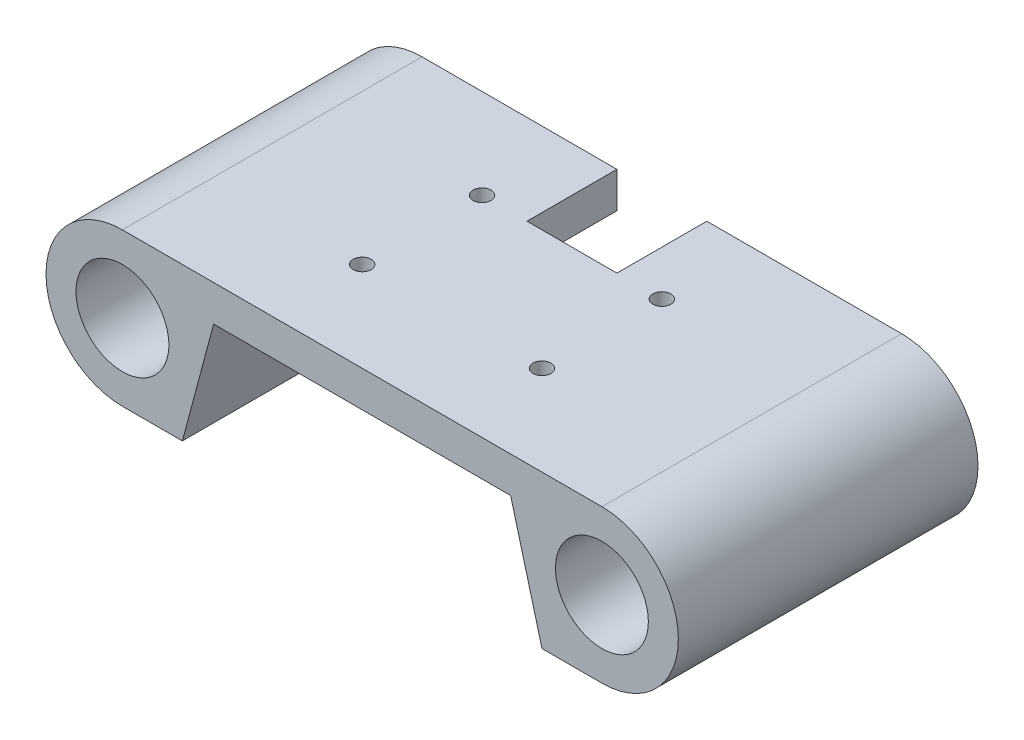
ISO-10303-21;
HEADER;
FILE_DESCRIPTION(('STEP AP214'),'2;1');
FILE_NAME('part.step','',(''),(''),'','','');
FILE_SCHEMA(('AUTOMOTIVE_DESIGN { 1 0 10303 214 1 1 1 1 }'));
ENDSEC;
DATA;
#1=APPLICATION_CONTEXT('core data for automotive mechanical design processes');
#2=APPLICATION_PROTOCOL_DEFINITION('international standard','automotive_design',2000,#1);
#3=PRODUCT_CONTEXT('',#1,'mechanical');
#4=PRODUCT('Part','Part','',(#3));
#5=PRODUCT_RELATED_PRODUCT_CATEGORY('part','',(#4));
#6=PRODUCT_DEFINITION_FORMATION('','',#4);
#7=PRODUCT_DEFINITION_CONTEXT('part definition',#1,'design');
#8=PRODUCT_DEFINITION('design','',#6,#7);
#9=PRODUCT_DEFINITION_SHAPE('','',#8);
#10=(LENGTH_UNIT() NAMED_UNIT(*) SI_UNIT(.MILLI.,.METRE.));
#11=(NAMED_UNIT(*) PLANE_ANGLE_UNIT() SI_UNIT($,.RADIAN.));
#12=(NAMED_UNIT(*) SI_UNIT($,.STERADIAN.) SOLID_ANGLE_UNIT());
#13=UNCERTAINTY_MEASURE_WITH_UNIT(LENGTH_MEASURE(1.E-05),#10,'distance_accuracy_value','');
#14=(GEOMETRIC_REPRESENTATION_CONTEXT(3) GLOBAL_UNCERTAINTY_ASSIGNED_CONTEXT((#13)) GLOBAL_UNIT_ASSIGNED_CONTEXT((#10,
#11,#12)) REPRESENTATION_CONTEXT('',''));
#15=CARTESIAN_POINT('',(0.,0.,0.));
#16=DIRECTION('',(0.,0.,1.));
#17=DIRECTION('',(1.,0.,0.));
#18=AXIS2_PLACEMENT_3D('',#15,#16,#17);
#19=CARTESIAN_POINT('',(-40.,-12.7495214725428,0.));
#20=DIRECTION('',(0.,0.,1.));
#21=DIRECTION('',(1.,0.,0.));
#22=AXIS2_PLACEMENT_3D('',#19,#20,#21);
#23=PLANE('',#22);
#24=CARTESIAN_POINT('',(40.,-12.7495214725428,0.));
#25=DIRECTION('',(0.,0.,1.));
#26=DIRECTION('',(1.,0.,0.));
#27=AXIS2_PLACEMENT_3D('',#24,#25,#26);
#28=CIRCLE('',#27,7.75);
#29=CARTESIAN_POINT('',(47.75,-12.7495214725428,0.));
#30=VERTEX_POINT('',#29);
#31=EDGE_CURVE('E255',#30,#30,#28,.T.);
#32=ORIENTED_EDGE('',*,*,#31,.T.);
#33=EDGE_LOOP('',(#32));
#34=FACE_BOUND('',#33,.T.);
#35=DIRECTION('',(1.,0.,0.));
#36=VECTOR('',#35,1.);
#37=CARTESIAN_POINT('',(-24.7752471896846,-6.00000000000001,0.));
#38=LINE('',#37,#36);
#39=CARTESIAN_POINT('',(7.50000000000001,-6.00000000000001,0.));
#40=VERTEX_POINT('',#39);
#41=CARTESIAN_POINT('',(24.7752471896846,-6.,0.));
#42=VERTEX_POINT('',#41);
#43=EDGE_CURVE('E152',#40,#42,#38,.T.);
#44=ORIENTED_EDGE('',*,*,#43,.F.);
#45=DIRECTION('',(0.,-1.,0.));
#46=VECTOR('',#45,1.);
#47=CARTESIAN_POINT('',(7.5,4.50095705491443,0.));
#48=LINE('',#47,#46);
#49=CARTESIAN_POINT('',(7.5,0.,0.));
#50=VERTEX_POINT('',#49);
#51=EDGE_CURVE('E189',#50,#40,#48,.T.);
#52=ORIENTED_EDGE('',*,*,#51,.F.);
#53=DIRECTION('',(-1.,0.,0.));
#54=VECTOR('',#53,1.);
#55=CARTESIAN_POINT('',(40.,0.,0.));
#56=LINE('',#55,#54);
#57=CARTESIAN_POINT('',(40.,0.,0.));
#58=VERTEX_POINT('',#57);
#59=EDGE_CURVE('E161',#58,#50,#56,.T.);
#60=ORIENTED_EDGE('',*,*,#59,.F.);
#61=CARTESIAN_POINT('',(40.,-12.7495214725428,0.));
#62=DIRECTION('',(0.,0.,1.));
#63=DIRECTION('',(1.,0.,0.));
#64=AXIS2_PLACEMENT_3D('',#61,#62,#63);
#65=CIRCLE('',#64,12.7495214725428);
#66=CARTESIAN_POINT('',(40.,-25.4990429450856,0.));
#67=VERTEX_POINT('',#66);
#68=EDGE_CURVE('E159',#67,#58,#65,.T.);
#69=ORIENTED_EDGE('',*,*,#68,.F.);
#70=DIRECTION('',(1.,0.,0.));
#71=VECTOR('',#70,1.);
#72=CARTESIAN_POINT('',(40.,-25.4990429450856,0.));
#73=LINE('',#72,#71);
#74=CARTESIAN_POINT('',(30.,-25.4990429450856,0.));
#75=VERTEX_POINT('',#74);
#76=EDGE_CURVE('E131',#75,#67,#73,.T.);
#77=ORIENTED_EDGE('',*,*,#76,.F.);
#78=DIRECTION('',(0.258819045102518,-0.965925826289069,0.));
#79=VECTOR('',#78,1.);
#80=CARTESIAN_POINT('',(30.,-25.4990429450856,0.));
#81=LINE('',#80,#79);
#82=EDGE_CURVE('E156',#42,#75,#81,.T.);
#83=ORIENTED_EDGE('',*,*,#82,.F.);
#84=EDGE_LOOP('',(#44,#52,#60,#69,#77,#83));
#85=FACE_BOUND('',#84,.T.);
#86=ADVANCED_FACE('F33',(#34,#85),#23,.F.);
#87=CARTESIAN_POINT('',(-40.,-12.7495214725428,50.));
#88=DIRECTION('',(0.,0.,1.));
#89=DIRECTION('',(1.,0.,0.));
#90=AXIS2_PLACEMENT_3D('',#87,#88,#89);
#91=PLANE('',#90);
#92=CARTESIAN_POINT('',(40.,-12.7495214725428,50.));
#93=DIRECTION('',(0.,0.,1.));
#94=DIRECTION('',(1.,0.,0.));
#95=AXIS2_PLACEMENT_3D('',#92,#93,#94);
#96=CIRCLE('',#95,7.75);
#97=CARTESIAN_POINT('',(47.75,-12.7495214725428,50.));
#98=VERTEX_POINT('',#97);
#99=EDGE_CURVE('E148',#98,#98,#96,.T.);
#100=ORIENTED_EDGE('',*,*,#99,.F.);
#101=EDGE_LOOP('',(#100));
#102=FACE_BOUND('',#101,.T.);
#103=CARTESIAN_POINT('',(-40.,-12.7495214725428,50.));
#104=DIRECTION('',(0.,0.,1.));
#105=DIRECTION('',(1.,0.,0.));
#106=AXIS2_PLACEMENT_3D('',#103,#104,#105);
#107=CIRCLE('',#106,12.7495214725428);
#108=CARTESIAN_POINT('',(-40.,0.,50.));
#109=VERTEX_POINT('',#108);
#110=CARTESIAN_POINT('',(-40.,-25.4990429450856,50.));
#111=VERTEX_POINT('',#110);
#112=EDGE_CURVE('E164',#109,#111,#107,.T.);
#113=ORIENTED_EDGE('',*,*,#112,.T.);
#114=DIRECTION('',(1.,0.,0.));
#115=VECTOR('',#114,1.);
#116=CARTESIAN_POINT('',(-40.,-25.4990429450856,50.));
#117=LINE('',#116,#115);
#118=CARTESIAN_POINT('',(-30.,-25.4990429450856,50.));
#119=VERTEX_POINT('',#118);
#120=EDGE_CURVE('E99',#111,#119,#117,.T.);
#121=ORIENTED_EDGE('',*,*,#120,.T.);
#122=DIRECTION('',(0.258819045102518,0.965925826289069,0.));
#123=VECTOR('',#122,1.);
#124=CARTESIAN_POINT('',(-30.,-25.4990429450856,50.));
#125=LINE('',#124,#123);
#126=CARTESIAN_POINT('',(-24.7752471896846,-6.00000000000001,50.));
#127=VERTEX_POINT('',#126);
#128=EDGE_CURVE('E264',#119,#127,#125,.T.);
#129=ORIENTED_EDGE('',*,*,#128,.T.);
#130=DIRECTION('',(1.,0.,0.));
#131=VECTOR('',#130,1.);
#132=CARTESIAN_POINT('',(-24.7752471896846,-6.00000000000001,50.));
#133=LINE('',#132,#131);
#134=CARTESIAN_POINT('',(24.7752471896846,-6.,50.));
#135=VERTEX_POINT('',#134);
#136=EDGE_CURVE('E266',#127,#135,#133,.T.);
#137=ORIENTED_EDGE('',*,*,#136,.T.);
#138=DIRECTION('',(0.258819045102518,-0.965925826289069,0.));
#139=VECTOR('',#138,1.);
#140=CARTESIAN_POINT('',(30.,-25.4990429450856,50.));
#141=LINE('',#140,#139);
#142=CARTESIAN_POINT('',(30.,-25.4990429450856,50.));
#143=VERTEX_POINT('',#142);
#144=EDGE_CURVE('E122',#135,#143,#141,.T.);
#145=ORIENTED_EDGE('',*,*,#144,.T.);
#146=DIRECTION('',(1.,0.,0.));
#147=VECTOR('',#146,1.);
#148=CARTESIAN_POINT('',(40.,-25.4990429450856,50.));
#149=LINE('',#148,#147);
#150=CARTESIAN_POINT('',(40.,-25.4990429450856,50.));
#151=VERTEX_POINT('',#150);
#152=EDGE_CURVE('E114',#143,#151,#149,.T.);
#153=ORIENTED_EDGE('',*,*,#152,.T.);
#154=CARTESIAN_POINT('',(40.,-12.7495214725428,50.));
#155=DIRECTION('',(0.,0.,1.));
#156=DIRECTION('',(1.,0.,0.));
#157=AXIS2_PLACEMENT_3D('',#154,#155,#156);
#158=CIRCLE('',#157,12.7495214725428);
#159=CARTESIAN_POINT('',(40.,0.,50.));
#160=VERTEX_POINT('',#159);
#161=EDGE_CURVE('E119',#151,#160,#158,.T.);
#162=ORIENTED_EDGE('',*,*,#161,.T.);
#163=DIRECTION('',(-1.,0.,0.));
#164=VECTOR('',#163,1.);
#165=CARTESIAN_POINT('',(40.,0.,50.));
#166=LINE('',#165,#164);
#167=EDGE_CURVE('E57',#160,#109,#166,.T.);
#168=ORIENTED_EDGE('',*,*,#167,.T.);
#169=EDGE_LOOP('',(#113,#121,#129,#137,#145,#153,#162,#168));
#170=FACE_BOUND('',#169,.T.);
#171=CARTESIAN_POINT('',(-40.,-12.7495214725428,50.));
#172=DIRECTION('',(0.,0.,1.));
#173=DIRECTION('',(-1.,0.,0.));
#174=AXIS2_PLACEMENT_3D('',#171,#172,#173);
#175=CIRCLE('',#174,7.75);
#176=CARTESIAN_POINT('',(-47.75,-12.7495214725428,50.));
#177=VERTEX_POINT('',#176);
#178=EDGE_CURVE('E252',#177,#177,#175,.T.);
#179=ORIENTED_EDGE('',*,*,#178,.F.);
#180=EDGE_LOOP('',(#179));
#181=FACE_BOUND('',#180,.T.);
#182=ADVANCED_FACE('F116',(#102,#170,#181),#91,.T.);
#183=CARTESIAN_POINT('',(-7.5,0.,0.));
#184=VERTEX_POINT('',#183);
#185=CARTESIAN_POINT('',(-40.,0.,0.));
#186=VERTEX_POINT('',#185);
#187=EDGE_CURVE('E90',#184,#186,#56,.T.);
#188=ORIENTED_EDGE('',*,*,#187,.F.);
#189=DIRECTION('',(0.,-1.,0.));
#190=VECTOR('',#189,1.);
#191=CARTESIAN_POINT('',(-7.5,4.50095705491443,0.));
#192=LINE('',#191,#190);
#193=CARTESIAN_POINT('',(-7.5,-6.00000000000001,0.));
#194=VERTEX_POINT('',#193);
#195=EDGE_CURVE('E213',#184,#194,#192,.T.);
#196=ORIENTED_EDGE('',*,*,#195,.T.);
#197=CARTESIAN_POINT('',(-24.7752471896846,-6.00000000000001,0.));
#198=VERTEX_POINT('',#197);
#199=EDGE_CURVE('E153',#198,#194,#38,.T.);
#200=ORIENTED_EDGE('',*,*,#199,.F.);
#201=DIRECTION('',(0.258819045102518,0.965925826289069,0.));
#202=VECTOR('',#201,1.);
#203=CARTESIAN_POINT('',(-30.,-25.4990429450856,0.));
#204=LINE('',#203,#202);
#205=CARTESIAN_POINT('',(-30.,-25.4990429450856,0.));
#206=VERTEX_POINT('',#205);
#207=EDGE_CURVE('E150',#206,#198,#204,.T.);
#208=ORIENTED_EDGE('',*,*,#207,.F.);
#209=DIRECTION('',(1.,0.,0.));
#210=VECTOR('',#209,1.);
#211=CARTESIAN_POINT('',(-40.,-25.4990429450856,0.));
#212=LINE('',#211,#210);
#213=CARTESIAN_POINT('',(-40.,-25.4990429450856,0.));
#214=VERTEX_POINT('',#213);
#215=EDGE_CURVE('E147',#214,#206,#212,.T.);
#216=ORIENTED_EDGE('',*,*,#215,.F.);
#217=CARTESIAN_POINT('',(-40.,-12.7495214725428,0.));
#218=DIRECTION('',(0.,0.,1.));
#219=DIRECTION('',(1.,0.,0.));
#220=AXIS2_PLACEMENT_3D('',#217,#218,#219);
#221=CIRCLE('',#220,12.7495214725428);
#222=EDGE_CURVE('E144',#186,#214,#221,.T.);
#223=ORIENTED_EDGE('',*,*,#222,.F.);
#224=EDGE_LOOP('',(#188,#196,#200,#208,#216,#223));
#225=FACE_BOUND('',#224,.T.);
#226=CARTESIAN_POINT('',(-40.,-12.7495214725428,0.));
#227=DIRECTION('',(0.,0.,1.));
#228=DIRECTION('',(-1.,0.,0.));
#229=AXIS2_PLACEMENT_3D('',#226,#227,#228);
#230=CIRCLE('',#229,7.75);
#231=CARTESIAN_POINT('',(-47.75,-12.7495214725428,0.));
#232=VERTEX_POINT('',#231);
#233=EDGE_CURVE('E251',#232,#232,#230,.T.);
#234=ORIENTED_EDGE('',*,*,#233,.T.);
#235=EDGE_LOOP('',(#234));
#236=FACE_BOUND('',#235,.T.);
#237=ADVANCED_FACE('F210',(#225,#236),#23,.F.);
#238=CARTESIAN_POINT('',(-40.,-12.7495214725428,50.));
#239=DIRECTION('',(0.,0.,-1.));
#240=DIRECTION('',(-1.,0.,0.));
#241=AXIS2_PLACEMENT_3D('',#238,#239,#240);
#242=CYLINDRICAL_SURFACE('',#241,12.7495214725428);
#243=ORIENTED_EDGE('',*,*,#222,.T.);
#244=DIRECTION('',(0.,0.,-1.));
#245=VECTOR('',#244,1.);
#246=CARTESIAN_POINT('',(-40.,-25.4990429450856,50.));
#247=LINE('',#246,#245);
#248=EDGE_CURVE('E177',#111,#214,#247,.T.);
#249=ORIENTED_EDGE('',*,*,#248,.F.);
#250=ORIENTED_EDGE('',*,*,#112,.F.);
#251=DIRECTION('',(0.,0.,-1.));
#252=VECTOR('',#251,1.);
#253=CARTESIAN_POINT('',(-40.,0.,50.));
#254=LINE('',#253,#252);
#255=EDGE_CURVE('E140',#109,#186,#254,.T.);
#256=ORIENTED_EDGE('',*,*,#255,.T.);
#257=EDGE_LOOP('',(#243,#249,#250,#256));
#258=FACE_BOUND('',#257,.T.);
#259=ADVANCED_FACE('F35',(#258),#242,.T.);
#260=CARTESIAN_POINT('',(-40.,-25.4990429450856,50.));
#261=DIRECTION('',(0.,1.,0.));
#262=DIRECTION('',(-1.,0.,0.));
#263=AXIS2_PLACEMENT_3D('',#260,#261,#262);
#264=PLANE('',#263);
#265=ORIENTED_EDGE('',*,*,#215,.T.);
#266=DIRECTION('',(0.,0.,-1.));
#267=VECTOR('',#266,1.);
#268=CARTESIAN_POINT('',(-30.,-25.4990429450856,50.));
#269=LINE('',#268,#267);
#270=EDGE_CURVE('E174',#119,#206,#269,.T.);
#271=ORIENTED_EDGE('',*,*,#270,.F.);
#272=ORIENTED_EDGE('',*,*,#120,.F.);
#273=ORIENTED_EDGE('',*,*,#248,.T.);
#274=EDGE_LOOP('',(#265,#271,#272,#273));
#275=FACE_BOUND('',#274,.T.);
#276=ADVANCED_FACE('F298',(#275),#264,.F.);
#277=CARTESIAN_POINT('',(-30.,-25.4990429450856,50.));
#278=DIRECTION('',(-0.965925826289069,0.258819045102518,0.));
#279=DIRECTION('',(-0.258819045102518,-0.965925826289069,0.));
#280=AXIS2_PLACEMENT_3D('',#277,#278,#279);
#281=PLANE('',#280);
#282=ORIENTED_EDGE('',*,*,#207,.T.);
#283=DIRECTION('',(0.,0.,-1.));
#284=VECTOR('',#283,1.);
#285=CARTESIAN_POINT('',(-24.7752471896846,-6.00000000000001,50.));
#286=LINE('',#285,#284);
#287=EDGE_CURVE('E171',#127,#198,#286,.T.);
#288=ORIENTED_EDGE('',*,*,#287,.F.);
#289=ORIENTED_EDGE('',*,*,#128,.F.);
#290=ORIENTED_EDGE('',*,*,#270,.T.);
#291=EDGE_LOOP('',(#282,#288,#289,#290));
#292=FACE_BOUND('',#291,.T.);
#293=ADVANCED_FACE('F282',(#292),#281,.F.);
#294=CARTESIAN_POINT('',(-24.7752471896846,-6.00000000000001,50.));
#295=DIRECTION('',(0.,1.,0.));
#296=DIRECTION('',(-1.,0.,0.));
#297=AXIS2_PLACEMENT_3D('',#294,#295,#296);
#298=PLANE('',#297);
#299=CARTESIAN_POINT('',(-15.,-6.00000000000001,35.));
#300=DIRECTION('',(0.,1.,0.));
#301=DIRECTION('',(-1.,0.,0.));
#302=AXIS2_PLACEMENT_3D('',#299,#300,#301);
#303=CIRCLE('',#302,1.5);
#304=CARTESIAN_POINT('',(-16.5,-6.00000000000001,35.));
#305=VERTEX_POINT('',#304);
#306=EDGE_CURVE('E197',#305,#305,#303,.T.);
#307=ORIENTED_EDGE('',*,*,#306,.T.);
#308=EDGE_LOOP('',(#307));
#309=FACE_BOUND('',#308,.T.);
#310=CARTESIAN_POINT('',(-15.,-6.00000000000001,15.));
#311=DIRECTION('',(0.,1.,0.));
#312=DIRECTION('',(-1.,0.,0.));
#313=AXIS2_PLACEMENT_3D('',#310,#311,#312);
#314=CIRCLE('',#313,1.5);
#315=CARTESIAN_POINT('',(-16.5,-6.00000000000001,15.));
#316=VERTEX_POINT('',#315);
#317=EDGE_CURVE('E193',#316,#316,#314,.T.);
#318=ORIENTED_EDGE('',*,*,#317,.T.);
#319=EDGE_LOOP('',(#318));
#320=FACE_BOUND('',#319,.T.);
#321=CARTESIAN_POINT('',(15.,-6.,15.));
#322=DIRECTION('',(0.,1.,0.));
#323=DIRECTION('',(-1.,0.,0.));
#324=AXIS2_PLACEMENT_3D('',#321,#322,#323);
#325=CIRCLE('',#324,1.5);
#326=CARTESIAN_POINT('',(13.5,-6.,15.));
#327=VERTEX_POINT('',#326);
#328=EDGE_CURVE('E188',#327,#327,#325,.T.);
#329=ORIENTED_EDGE('',*,*,#328,.T.);
#330=EDGE_LOOP('',(#329));
#331=FACE_BOUND('',#330,.T.);
#332=CARTESIAN_POINT('',(15.,-6.,35.));
#333=DIRECTION('',(0.,1.,0.));
#334=DIRECTION('',(-1.,0.,0.));
#335=AXIS2_PLACEMENT_3D('',#332,#333,#334);
#336=CIRCLE('',#335,1.5);
#337=CARTESIAN_POINT('',(13.5,-6.,35.));
#338=VERTEX_POINT('',#337);
#339=EDGE_CURVE('E183',#338,#338,#336,.T.);
#340=ORIENTED_EDGE('',*,*,#339,.T.);
#341=EDGE_LOOP('',(#340));
#342=FACE_BOUND('',#341,.T.);
#343=DIRECTION('',(1.,0.,0.));
#344=VECTOR('',#343,1.);
#345=CARTESIAN_POINT('',(-24.7752471896846,-6.00000000000001,15.));
#346=LINE('',#345,#344);
#347=CARTESIAN_POINT('',(-7.5,-6.00000000000001,15.));
#348=VERTEX_POINT('',#347);
#349=CARTESIAN_POINT('',(7.5,-6.00000000000001,15.));
#350=VERTEX_POINT('',#349);
#351=EDGE_CURVE('E242',#348,#350,#346,.T.);
#352=ORIENTED_EDGE('',*,*,#351,.T.);
#353=DIRECTION('',(0.,0.,-1.));
#354=VECTOR('',#353,1.);
#355=CARTESIAN_POINT('',(7.5,-6.00000000000001,50.));
#356=LINE('',#355,#354);
#357=EDGE_CURVE('E184',#350,#40,#356,.T.);
#358=ORIENTED_EDGE('',*,*,#357,.T.);
#359=ORIENTED_EDGE('',*,*,#43,.T.);
#360=DIRECTION('',(0.,0.,-1.));
#361=VECTOR('',#360,1.);
#362=CARTESIAN_POINT('',(24.7752471896846,-6.,50.));
#363=LINE('',#362,#361);
#364=EDGE_CURVE('E168',#135,#42,#363,.T.);
#365=ORIENTED_EDGE('',*,*,#364,.F.);
#366=ORIENTED_EDGE('',*,*,#136,.F.);
#367=ORIENTED_EDGE('',*,*,#287,.T.);
#368=ORIENTED_EDGE('',*,*,#199,.T.);
#369=DIRECTION('',(0.,0.,1.));
#370=VECTOR('',#369,1.);
#371=CARTESIAN_POINT('',(-7.5,-6.00000000000001,50.));
#372=LINE('',#371,#370);
#373=EDGE_CURVE('E245',#194,#348,#372,.T.);
#374=ORIENTED_EDGE('',*,*,#373,.T.);
#375=EDGE_LOOP('',(#352,#358,#359,#365,#366,#367,#368,#374));
#376=FACE_BOUND('',#375,.T.);
#377=ADVANCED_FACE('F272',(#309,#320,#331,#342,#376),#298,.F.);
#378=CARTESIAN_POINT('',(30.,-25.4990429450856,50.));
#379=DIRECTION('',(0.965925826289069,0.258819045102518,0.));
#380=DIRECTION('',(-0.258819045102518,0.965925826289069,0.));
#381=AXIS2_PLACEMENT_3D('',#378,#379,#380);
#382=PLANE('',#381);
#383=ORIENTED_EDGE('',*,*,#82,.T.);
#384=DIRECTION('',(0.,0.,-1.));
#385=VECTOR('',#384,1.);
#386=CARTESIAN_POINT('',(30.,-25.4990429450856,50.));
#387=LINE('',#386,#385);
#388=EDGE_CURVE('E134',#143,#75,#387,.T.);
#389=ORIENTED_EDGE('',*,*,#388,.F.);
#390=ORIENTED_EDGE('',*,*,#144,.F.);
#391=ORIENTED_EDGE('',*,*,#364,.T.);
#392=EDGE_LOOP('',(#383,#389,#390,#391));
#393=FACE_BOUND('',#392,.T.);
#394=ADVANCED_FACE('F274',(#393),#382,.F.);
#395=CARTESIAN_POINT('',(40.,-25.4990429450856,50.));
#396=DIRECTION('',(0.,1.,0.));
#397=DIRECTION('',(0.,0.,1.));
#398=AXIS2_PLACEMENT_3D('',#395,#396,#397);
#399=PLANE('',#398);
#400=ORIENTED_EDGE('',*,*,#76,.T.);
#401=DIRECTION('',(0.,0.,-1.));
#402=VECTOR('',#401,1.);
#403=CARTESIAN_POINT('',(40.,-25.4990429450856,50.));
#404=LINE('',#403,#402);
#405=EDGE_CURVE('E128',#151,#67,#404,.T.);
#406=ORIENTED_EDGE('',*,*,#405,.F.);
#407=ORIENTED_EDGE('',*,*,#152,.F.);
#408=ORIENTED_EDGE('',*,*,#388,.T.);
#409=EDGE_LOOP('',(#400,#406,#407,#408));
#410=FACE_BOUND('',#409,.T.);
#411=ADVANCED_FACE('F129',(#410),#399,.F.);
#412=CARTESIAN_POINT('',(40.,-12.7495214725428,50.));
#413=DIRECTION('',(0.,0.,-1.));
#414=DIRECTION('',(-1.,0.,0.));
#415=AXIS2_PLACEMENT_3D('',#412,#413,#414);
#416=CYLINDRICAL_SURFACE('',#415,12.7495214725428);
#417=ORIENTED_EDGE('',*,*,#68,.T.);
#418=DIRECTION('',(0.,0.,-1.));
#419=VECTOR('',#418,1.);
#420=CARTESIAN_POINT('',(40.,0.,50.));
#421=LINE('',#420,#419);
#422=EDGE_CURVE('E135',#160,#58,#421,.T.);
#423=ORIENTED_EDGE('',*,*,#422,.F.);
#424=ORIENTED_EDGE('',*,*,#161,.F.);
#425=ORIENTED_EDGE('',*,*,#405,.T.);
#426=EDGE_LOOP('',(#417,#423,#424,#425));
#427=FACE_BOUND('',#426,.T.);
#428=ADVANCED_FACE('F137',(#427),#416,.T.);
#429=CARTESIAN_POINT('',(40.,0.,50.));
#430=DIRECTION('',(0.,-1.,0.));
#431=DIRECTION('',(1.,0.,0.));
#432=AXIS2_PLACEMENT_3D('',#429,#430,#431);
#433=PLANE('',#432);
#434=ORIENTED_EDGE('',*,*,#59,.T.);
#435=DIRECTION('',(0.,0.,1.));
#436=VECTOR('',#435,1.);
#437=CARTESIAN_POINT('',(7.49999999999999,0.,50.));
#438=LINE('',#437,#436);
#439=CARTESIAN_POINT('',(7.5,0.,15.));
#440=VERTEX_POINT('',#439);
#441=EDGE_CURVE('E11',#50,#440,#438,.T.);
#442=ORIENTED_EDGE('',*,*,#441,.T.);
#443=DIRECTION('',(-1.,0.,0.));
#444=VECTOR('',#443,1.);
#445=CARTESIAN_POINT('',(40.,0.,15.));
#446=LINE('',#445,#444);
#447=CARTESIAN_POINT('',(-7.5,0.,15.));
#448=VERTEX_POINT('',#447);
#449=EDGE_CURVE('E179',#440,#448,#446,.T.);
#450=ORIENTED_EDGE('',*,*,#449,.T.);
#451=DIRECTION('',(0.,0.,-1.));
#452=VECTOR('',#451,1.);
#453=CARTESIAN_POINT('',(-7.5,0.,50.));
#454=LINE('',#453,#452);
#455=EDGE_CURVE('E41',#448,#184,#454,.T.);
#456=ORIENTED_EDGE('',*,*,#455,.T.);
#457=ORIENTED_EDGE('',*,*,#187,.T.);
#458=ORIENTED_EDGE('',*,*,#255,.F.);
#459=ORIENTED_EDGE('',*,*,#167,.F.);
#460=ORIENTED_EDGE('',*,*,#422,.T.);
#461=EDGE_LOOP('',(#434,#442,#450,#456,#457,#458,#459,#460));
#462=FACE_BOUND('',#461,.T.);
#463=CARTESIAN_POINT('',(-15.,0.,35.));
#464=DIRECTION('',(0.,-1.,0.));
#465=DIRECTION('',(1.,0.,0.));
#466=AXIS2_PLACEMENT_3D('',#463,#464,#465);
#467=CIRCLE('',#466,1.5);
#468=CARTESIAN_POINT('',(-13.5,0.,35.));
#469=VERTEX_POINT('',#468);
#470=EDGE_CURVE('E194',#469,#469,#467,.T.);
#471=ORIENTED_EDGE('',*,*,#470,.T.);
#472=EDGE_LOOP('',(#471));
#473=FACE_BOUND('',#472,.T.);
#474=CARTESIAN_POINT('',(-15.,0.,15.));
#475=DIRECTION('',(0.,-1.,0.));
#476=DIRECTION('',(1.,0.,0.));
#477=AXIS2_PLACEMENT_3D('',#474,#475,#476);
#478=CIRCLE('',#477,1.5);
#479=CARTESIAN_POINT('',(-13.5,0.,15.));
#480=VERTEX_POINT('',#479);
#481=EDGE_CURVE('E190',#480,#480,#478,.T.);
#482=ORIENTED_EDGE('',*,*,#481,.T.);
#483=EDGE_LOOP('',(#482));
#484=FACE_BOUND('',#483,.T.);
#485=CARTESIAN_POINT('',(15.,0.,15.));
#486=DIRECTION('',(0.,-1.,0.));
#487=DIRECTION('',(1.,0.,0.));
#488=AXIS2_PLACEMENT_3D('',#485,#486,#487);
#489=CIRCLE('',#488,1.5);
#490=CARTESIAN_POINT('',(16.5,0.,15.));
#491=VERTEX_POINT('',#490);
#492=EDGE_CURVE('E185',#491,#491,#489,.T.);
#493=ORIENTED_EDGE('',*,*,#492,.T.);
#494=EDGE_LOOP('',(#493));
#495=FACE_BOUND('',#494,.T.);
#496=CARTESIAN_POINT('',(15.,0.,35.));
#497=DIRECTION('',(0.,-1.,0.));
#498=DIRECTION('',(1.,0.,0.));
#499=AXIS2_PLACEMENT_3D('',#496,#497,#498);
#500=CIRCLE('',#499,1.5);
#501=CARTESIAN_POINT('',(16.5,0.,35.));
#502=VERTEX_POINT('',#501);
#503=EDGE_CURVE('E180',#502,#502,#500,.T.);
#504=ORIENTED_EDGE('',*,*,#503,.T.);
#505=EDGE_LOOP('',(#504));
#506=FACE_BOUND('',#505,.T.);
#507=ADVANCED_FACE('F200',(#462,#473,#484,#495,#506),#433,.F.);
#508=CARTESIAN_POINT('',(40.,-12.7495214725428,50.));
#509=DIRECTION('',(0.,0.,-1.));
#510=DIRECTION('',(-1.,0.,0.));
#511=AXIS2_PLACEMENT_3D('',#508,#509,#510);
#512=CYLINDRICAL_SURFACE('',#511,7.75);
#513=ORIENTED_EDGE('',*,*,#99,.T.);
#514=EDGE_LOOP('',(#513));
#515=FACE_BOUND('',#514,.T.);
#516=ORIENTED_EDGE('',*,*,#31,.F.);
#517=EDGE_LOOP('',(#516));
#518=FACE_BOUND('',#517,.T.);
#519=ADVANCED_FACE('F344',(#515,#518),#512,.F.);
#520=CARTESIAN_POINT('',(-40.,-12.7495214725428,50.));
#521=DIRECTION('',(0.,0.,-1.));
#522=DIRECTION('',(-1.,0.,0.));
#523=AXIS2_PLACEMENT_3D('',#520,#521,#522);
#524=CYLINDRICAL_SURFACE('',#523,7.75);
#525=ORIENTED_EDGE('',*,*,#178,.T.);
#526=EDGE_LOOP('',(#525));
#527=FACE_BOUND('',#526,.T.);
#528=ORIENTED_EDGE('',*,*,#233,.F.);
#529=EDGE_LOOP('',(#528));
#530=FACE_BOUND('',#529,.T.);
#531=ADVANCED_FACE('F340',(#527,#530),#524,.F.);
#532=CARTESIAN_POINT('',(15.,4.50095705491444,35.));
#533=DIRECTION('',(0.,-1.,0.));
#534=DIRECTION('',(1.,0.,0.));
#535=AXIS2_PLACEMENT_3D('',#532,#533,#534);
#536=CYLINDRICAL_SURFACE('',#535,1.5);
#537=ORIENTED_EDGE('',*,*,#503,.F.);
#538=EDGE_LOOP('',(#537));
#539=FACE_BOUND('',#538,.T.);
#540=ORIENTED_EDGE('',*,*,#339,.F.);
#541=EDGE_LOOP('',(#540));
#542=FACE_BOUND('',#541,.T.);
#543=ADVANCED_FACE('F333',(#539,#542),#536,.F.);
#544=CARTESIAN_POINT('',(15.,4.50095705491444,15.));
#545=DIRECTION('',(0.,-1.,0.));
#546=DIRECTION('',(1.,0.,0.));
#547=AXIS2_PLACEMENT_3D('',#544,#545,#546);
#548=CYLINDRICAL_SURFACE('',#547,1.5);
#549=ORIENTED_EDGE('',*,*,#492,.F.);
#550=EDGE_LOOP('',(#549));
#551=FACE_BOUND('',#550,.T.);
#552=ORIENTED_EDGE('',*,*,#328,.F.);
#553=EDGE_LOOP('',(#552));
#554=FACE_BOUND('',#553,.T.);
#555=ADVANCED_FACE('F329',(#551,#554),#548,.F.);
#556=CARTESIAN_POINT('',(-15.,4.50095705491442,15.));
#557=DIRECTION('',(0.,-1.,0.));
#558=DIRECTION('',(1.,0.,0.));
#559=AXIS2_PLACEMENT_3D('',#556,#557,#558);
#560=CYLINDRICAL_SURFACE('',#559,1.5);
#561=ORIENTED_EDGE('',*,*,#481,.F.);
#562=EDGE_LOOP('',(#561));
#563=FACE_BOUND('',#562,.T.);
#564=ORIENTED_EDGE('',*,*,#317,.F.);
#565=EDGE_LOOP('',(#564));
#566=FACE_BOUND('',#565,.T.);
#567=ADVANCED_FACE('F332',(#563,#566),#560,.F.);
#568=CARTESIAN_POINT('',(-15.,4.50095705491442,35.));
#569=DIRECTION('',(0.,-1.,0.));
#570=DIRECTION('',(1.,0.,0.));
#571=AXIS2_PLACEMENT_3D('',#568,#569,#570);
#572=CYLINDRICAL_SURFACE('',#571,1.5);
#573=ORIENTED_EDGE('',*,*,#470,.F.);
#574=EDGE_LOOP('',(#573));
#575=FACE_BOUND('',#574,.T.);
#576=ORIENTED_EDGE('',*,*,#306,.F.);
#577=EDGE_LOOP('',(#576));
#578=FACE_BOUND('',#577,.T.);
#579=ADVANCED_FACE('F325',(#575,#578),#572,.F.);
#580=CARTESIAN_POINT('',(7.5,4.50095705491443,15.));
#581=DIRECTION('',(1.,0.,0.));
#582=DIRECTION('',(0.,1.,0.));
#583=AXIS2_PLACEMENT_3D('',#580,#581,#582);
#584=PLANE('',#583);
#585=DIRECTION('',(0.,-1.,0.));
#586=VECTOR('',#585,1.);
#587=CARTESIAN_POINT('',(7.5,4.50095705491443,15.));
#588=LINE('',#587,#586);
#589=EDGE_CURVE('E233',#440,#350,#588,.T.);
#590=ORIENTED_EDGE('',*,*,#589,.F.);
#591=ORIENTED_EDGE('',*,*,#441,.F.);
#592=ORIENTED_EDGE('',*,*,#51,.T.);
#593=ORIENTED_EDGE('',*,*,#357,.F.);
#594=EDGE_LOOP('',(#590,#591,#592,#593));
#595=FACE_BOUND('',#594,.T.);
#596=ADVANCED_FACE('F316',(#595),#584,.F.);
#597=CARTESIAN_POINT('',(-7.5,4.50095705491443,15.));
#598=DIRECTION('',(-1.,0.,0.));
#599=DIRECTION('',(0.,-1.,0.));
#600=AXIS2_PLACEMENT_3D('',#597,#598,#599);
#601=PLANE('',#600);
#602=ORIENTED_EDGE('',*,*,#195,.F.);
#603=ORIENTED_EDGE('',*,*,#455,.F.);
#604=DIRECTION('',(0.,-1.,0.));
#605=VECTOR('',#604,1.);
#606=CARTESIAN_POINT('',(-7.5,4.50095705491443,15.));
#607=LINE('',#606,#605);
#608=EDGE_CURVE('E48',#448,#348,#607,.T.);
#609=ORIENTED_EDGE('',*,*,#608,.T.);
#610=ORIENTED_EDGE('',*,*,#373,.F.);
#611=EDGE_LOOP('',(#602,#603,#609,#610));
#612=FACE_BOUND('',#611,.T.);
#613=ADVANCED_FACE('F317',(#612),#601,.F.);
#614=CARTESIAN_POINT('',(-7.5,4.50095705491443,15.));
#615=DIRECTION('',(0.,0.,1.));
#616=DIRECTION('',(1.,0.,0.));
#617=AXIS2_PLACEMENT_3D('',#614,#615,#616);
#618=PLANE('',#617);
#619=ORIENTED_EDGE('',*,*,#608,.F.);
#620=ORIENTED_EDGE('',*,*,#449,.F.);
#621=ORIENTED_EDGE('',*,*,#589,.T.);
#622=ORIENTED_EDGE('',*,*,#351,.F.);
#623=EDGE_LOOP('',(#619,#620,#621,#622));
#624=FACE_BOUND('',#623,.T.);
#625=ADVANCED_FACE('F315',(#624),#618,.F.);
#626=CLOSED_SHELL('',(#86,#182,#237,#259,#276,#293,#377,#394,#411,#428,#507,#519,#531,#543,#555,
#567,#579,#596,#613,#625));
#627=MANIFOLD_SOLID_BREP('B2',#626);
#628=ADVANCED_BREP_SHAPE_REPRESENTATION('',(#18,#627),#14);
#629=SHAPE_DEFINITION_REPRESENTATION(#9,#628);
ENDSEC;
END-ISO-10303-21;
